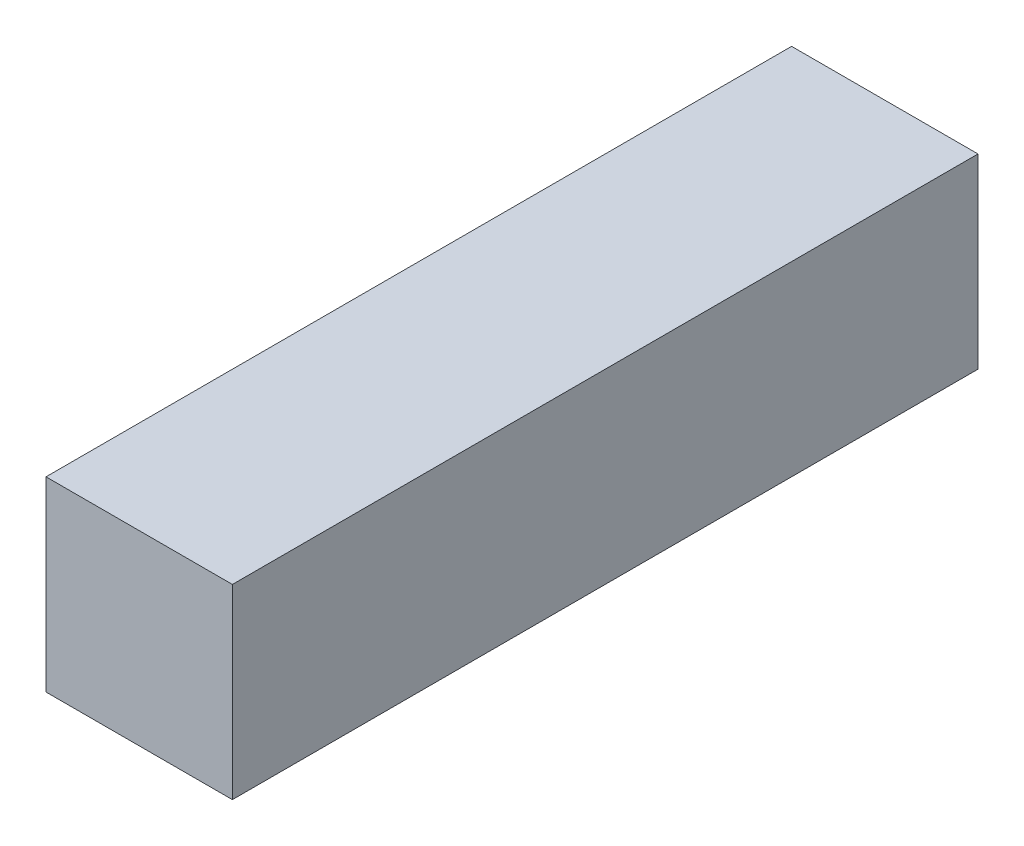
ISO-10303-21;
HEADER;
FILE_DESCRIPTION(('STEP AP214'),'2;1');
FILE_NAME('part.step','',(''),(''),'','','');
FILE_SCHEMA(('AUTOMOTIVE_DESIGN { 1 0 10303 214 1 1 1 1 }'));
ENDSEC;
DATA;
#1=APPLICATION_CONTEXT('core data for automotive mechanical design processes');
#2=APPLICATION_PROTOCOL_DEFINITION('international standard','automotive_design',2000,#1);
#3=PRODUCT_CONTEXT('',#1,'mechanical');
#4=PRODUCT('Part','Part','',(#3));
#5=PRODUCT_RELATED_PRODUCT_CATEGORY('part','',(#4));
#6=PRODUCT_DEFINITION_FORMATION('','',#4);
#7=PRODUCT_DEFINITION_CONTEXT('part definition',#1,'design');
#8=PRODUCT_DEFINITION('design','',#6,#7);
#9=PRODUCT_DEFINITION_SHAPE('','',#8);
#10=(LENGTH_UNIT() NAMED_UNIT(*) SI_UNIT(.MILLI.,.METRE.));
#11=(NAMED_UNIT(*) PLANE_ANGLE_UNIT() SI_UNIT($,.RADIAN.));
#12=(NAMED_UNIT(*) SI_UNIT($,.STERADIAN.) SOLID_ANGLE_UNIT());
#13=UNCERTAINTY_MEASURE_WITH_UNIT(LENGTH_MEASURE(1.E-05),#10,'distance_accuracy_value','');
#14=(GEOMETRIC_REPRESENTATION_CONTEXT(3) GLOBAL_UNCERTAINTY_ASSIGNED_CONTEXT((#13)) GLOBAL_UNIT_ASSIGNED_CONTEXT((#10,
#11,#12)) REPRESENTATION_CONTEXT('',''));
#15=CARTESIAN_POINT('',(0.,0.,0.));
#16=DIRECTION('',(0.,0.,1.));
#17=DIRECTION('',(1.,0.,0.));
#18=AXIS2_PLACEMENT_3D('',#15,#16,#17);
#19=CARTESIAN_POINT('',(-1.5875,-1.5875,12.7));
#20=DIRECTION('',(1.,0.,0.));
#21=DIRECTION('',(0.,0.,-1.));
#22=AXIS2_PLACEMENT_3D('',#19,#20,#21);
#23=PLANE('',#22);
#24=DIRECTION('',(0.,-1.,0.));
#25=VECTOR('',#24,1.);
#26=CARTESIAN_POINT('',(-1.5875,-1.5875,0.));
#27=LINE('',#26,#25);
#28=CARTESIAN_POINT('',(-1.5875,1.5875,0.));
#29=VERTEX_POINT('',#28);
#30=CARTESIAN_POINT('',(-1.5875,-1.5875,0.));
#31=VERTEX_POINT('',#30);
#32=EDGE_CURVE('E96',#29,#31,#27,.T.);
#33=ORIENTED_EDGE('',*,*,#32,.T.);
#34=DIRECTION('',(0.,0.,-1.));
#35=VECTOR('',#34,1.);
#36=CARTESIAN_POINT('',(-1.5875,-1.5875,12.7));
#37=LINE('',#36,#35);
#38=CARTESIAN_POINT('',(-1.5875,-1.5875,12.7));
#39=VERTEX_POINT('',#38);
#40=EDGE_CURVE('E11',#39,#31,#37,.T.);
#41=ORIENTED_EDGE('',*,*,#40,.F.);
#42=DIRECTION('',(0.,-1.,0.));
#43=VECTOR('',#42,1.);
#44=CARTESIAN_POINT('',(-1.5875,-1.5875,12.7));
#45=LINE('',#44,#43);
#46=CARTESIAN_POINT('',(-1.5875,1.5875,12.7));
#47=VERTEX_POINT('',#46);
#48=EDGE_CURVE('E84',#47,#39,#45,.T.);
#49=ORIENTED_EDGE('',*,*,#48,.F.);
#50=DIRECTION('',(0.,0.,-1.));
#51=VECTOR('',#50,1.);
#52=CARTESIAN_POINT('',(-1.5875,1.5875,12.7));
#53=LINE('',#52,#51);
#54=EDGE_CURVE('E92',#47,#29,#53,.T.);
#55=ORIENTED_EDGE('',*,*,#54,.T.);
#56=EDGE_LOOP('',(#33,#41,#49,#55));
#57=FACE_BOUND('',#56,.T.);
#58=ADVANCED_FACE('F33',(#57),#23,.F.);
#59=CARTESIAN_POINT('',(1.5875,-1.5875,12.7));
#60=DIRECTION('',(0.,1.,0.));
#61=DIRECTION('',(-1.,0.,0.));
#62=AXIS2_PLACEMENT_3D('',#59,#60,#61);
#63=PLANE('',#62);
#64=DIRECTION('',(1.,0.,0.));
#65=VECTOR('',#64,1.);
#66=CARTESIAN_POINT('',(1.5875,-1.5875,0.));
#67=LINE('',#66,#65);
#68=CARTESIAN_POINT('',(1.5875,-1.5875,0.));
#69=VERTEX_POINT('',#68);
#70=EDGE_CURVE('E88',#31,#69,#67,.T.);
#71=ORIENTED_EDGE('',*,*,#70,.T.);
#72=DIRECTION('',(0.,0.,-1.));
#73=VECTOR('',#72,1.);
#74=CARTESIAN_POINT('',(1.5875,-1.5875,12.7));
#75=LINE('',#74,#73);
#76=CARTESIAN_POINT('',(1.5875,-1.5875,12.7));
#77=VERTEX_POINT('',#76);
#78=EDGE_CURVE('E41',#77,#69,#75,.T.);
#79=ORIENTED_EDGE('',*,*,#78,.F.);
#80=DIRECTION('',(1.,0.,0.));
#81=VECTOR('',#80,1.);
#82=CARTESIAN_POINT('',(1.5875,-1.5875,12.7));
#83=LINE('',#82,#81);
#84=EDGE_CURVE('E79',#39,#77,#83,.T.);
#85=ORIENTED_EDGE('',*,*,#84,.F.);
#86=ORIENTED_EDGE('',*,*,#40,.T.);
#87=EDGE_LOOP('',(#71,#79,#85,#86));
#88=FACE_BOUND('',#87,.T.);
#89=ADVANCED_FACE('F87',(#88),#63,.F.);
#90=CARTESIAN_POINT('',(1.5875,-1.5875,12.7));
#91=DIRECTION('',(-1.,0.,0.));
#92=DIRECTION('',(0.,0.,1.));
#93=AXIS2_PLACEMENT_3D('',#90,#91,#92);
#94=PLANE('',#93);
#95=DIRECTION('',(0.,1.,0.));
#96=VECTOR('',#95,1.);
#97=CARTESIAN_POINT('',(1.5875,-1.5875,0.));
#98=LINE('',#97,#96);
#99=CARTESIAN_POINT('',(1.5875,1.5875,0.));
#100=VERTEX_POINT('',#99);
#101=EDGE_CURVE('E66',#69,#100,#98,.T.);
#102=ORIENTED_EDGE('',*,*,#101,.T.);
#103=DIRECTION('',(0.,0.,-1.));
#104=VECTOR('',#103,1.);
#105=CARTESIAN_POINT('',(1.5875,1.5875,12.7));
#106=LINE('',#105,#104);
#107=CARTESIAN_POINT('',(1.5875,1.5875,12.7));
#108=VERTEX_POINT('',#107);
#109=EDGE_CURVE('E89',#108,#100,#106,.T.);
#110=ORIENTED_EDGE('',*,*,#109,.F.);
#111=DIRECTION('',(0.,1.,0.));
#112=VECTOR('',#111,1.);
#113=CARTESIAN_POINT('',(1.5875,-1.5875,12.7));
#114=LINE('',#113,#112);
#115=EDGE_CURVE('E82',#77,#108,#114,.T.);
#116=ORIENTED_EDGE('',*,*,#115,.F.);
#117=ORIENTED_EDGE('',*,*,#78,.T.);
#118=EDGE_LOOP('',(#102,#110,#116,#117));
#119=FACE_BOUND('',#118,.T.);
#120=ADVANCED_FACE('F90',(#119),#94,.F.);
#121=CARTESIAN_POINT('',(1.5875,1.5875,12.7));
#122=DIRECTION('',(0.,-1.,0.));
#123=DIRECTION('',(1.,0.,0.));
#124=AXIS2_PLACEMENT_3D('',#121,#122,#123);
#125=PLANE('',#124);
#126=DIRECTION('',(-1.,0.,0.));
#127=VECTOR('',#126,1.);
#128=CARTESIAN_POINT('',(1.5875,1.5875,0.));
#129=LINE('',#128,#127);
#130=EDGE_CURVE('E72',#100,#29,#129,.T.);
#131=ORIENTED_EDGE('',*,*,#130,.T.);
#132=ORIENTED_EDGE('',*,*,#54,.F.);
#133=DIRECTION('',(-1.,0.,0.));
#134=VECTOR('',#133,1.);
#135=CARTESIAN_POINT('',(1.5875,1.5875,12.7));
#136=LINE('',#135,#134);
#137=EDGE_CURVE('E49',#108,#47,#136,.T.);
#138=ORIENTED_EDGE('',*,*,#137,.F.);
#139=ORIENTED_EDGE('',*,*,#109,.T.);
#140=EDGE_LOOP('',(#131,#132,#138,#139));
#141=FACE_BOUND('',#140,.T.);
#142=ADVANCED_FACE('F103',(#141),#125,.F.);
#143=CARTESIAN_POINT('',(0.,0.,12.7));
#144=DIRECTION('',(0.,0.,1.));
#145=DIRECTION('',(1.,0.,0.));
#146=AXIS2_PLACEMENT_3D('',#143,#144,#145);
#147=PLANE('',#146);
#148=ORIENTED_EDGE('',*,*,#48,.T.);
#149=ORIENTED_EDGE('',*,*,#84,.T.);
#150=ORIENTED_EDGE('',*,*,#115,.T.);
#151=ORIENTED_EDGE('',*,*,#137,.T.);
#152=EDGE_LOOP('',(#148,#149,#150,#151));
#153=FACE_BOUND('',#152,.T.);
#154=ADVANCED_FACE('F80',(#153),#147,.T.);
#155=CARTESIAN_POINT('',(0.,0.,0.));
#156=DIRECTION('',(0.,0.,1.));
#157=DIRECTION('',(1.,0.,0.));
#158=AXIS2_PLACEMENT_3D('',#155,#156,#157);
#159=PLANE('',#158);
#160=ORIENTED_EDGE('',*,*,#32,.F.);
#161=ORIENTED_EDGE('',*,*,#130,.F.);
#162=ORIENTED_EDGE('',*,*,#101,.F.);
#163=ORIENTED_EDGE('',*,*,#70,.F.);
#164=EDGE_LOOP('',(#160,#161,#162,#163));
#165=FACE_BOUND('',#164,.T.);
#166=ADVANCED_FACE('F106',(#165),#159,.F.);
#167=CLOSED_SHELL('',(#58,#89,#120,#142,#154,#166));
#168=MANIFOLD_SOLID_BREP('B2',#167);
#169=ADVANCED_BREP_SHAPE_REPRESENTATION('',(#18,#168),#14);
#170=SHAPE_DEFINITION_REPRESENTATION(#9,#169);
ENDSEC;
END-ISO-10303-21;
